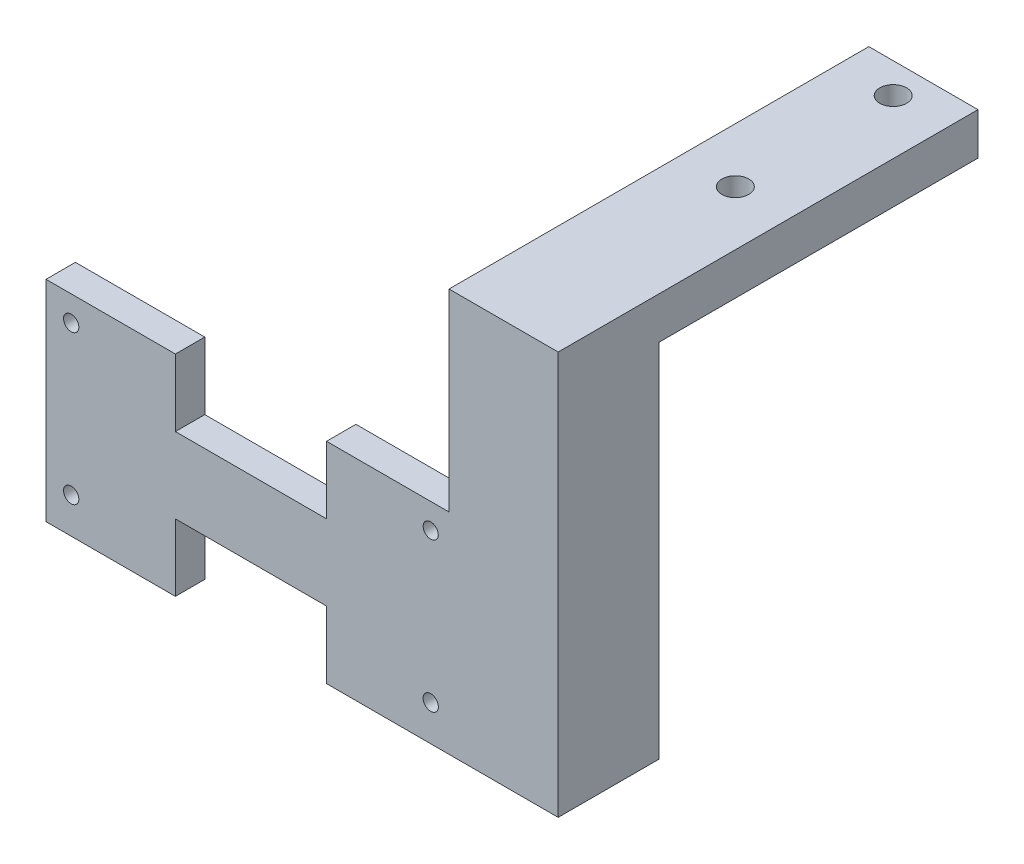
ISO-10303-21;
HEADER;
FILE_DESCRIPTION(('STEP AP214'),'2;1');
FILE_NAME('part.step','',(''),(''),'','','');
FILE_SCHEMA(('AUTOMOTIVE_DESIGN { 1 0 10303 214 1 1 1 1 }'));
ENDSEC;
DATA;
#1=APPLICATION_CONTEXT('core data for automotive mechanical design processes');
#2=APPLICATION_PROTOCOL_DEFINITION('international standard','automotive_design',2000,#1);
#3=PRODUCT_CONTEXT('',#1,'mechanical');
#4=PRODUCT('Part','Part','',(#3));
#5=PRODUCT_RELATED_PRODUCT_CATEGORY('part','',(#4));
#6=PRODUCT_DEFINITION_FORMATION('','',#4);
#7=PRODUCT_DEFINITION_CONTEXT('part definition',#1,'design');
#8=PRODUCT_DEFINITION('design','',#6,#7);
#9=PRODUCT_DEFINITION_SHAPE('','',#8);
#10=(LENGTH_UNIT() NAMED_UNIT(*) SI_UNIT(.MILLI.,.METRE.));
#11=(NAMED_UNIT(*) PLANE_ANGLE_UNIT() SI_UNIT($,.RADIAN.));
#12=(NAMED_UNIT(*) SI_UNIT($,.STERADIAN.) SOLID_ANGLE_UNIT());
#13=UNCERTAINTY_MEASURE_WITH_UNIT(LENGTH_MEASURE(1.E-05),#10,'distance_accuracy_value','');
#14=(GEOMETRIC_REPRESENTATION_CONTEXT(3) GLOBAL_UNCERTAINTY_ASSIGNED_CONTEXT((#13)) GLOBAL_UNIT_ASSIGNED_CONTEXT((#10,
#11,#12)) REPRESENTATION_CONTEXT('',''));
#15=CARTESIAN_POINT('',(0.,0.,0.));
#16=DIRECTION('',(0.,0.,1.));
#17=DIRECTION('',(1.,0.,0.));
#18=AXIS2_PLACEMENT_3D('',#15,#16,#17);
#19=CARTESIAN_POINT('',(0.,-45.5,0.));
#20=DIRECTION('',(0.,-1.,0.));
#21=DIRECTION('',(0.,0.,-1.));
#22=AXIS2_PLACEMENT_3D('',#19,#20,#21);
#23=PLANE('',#22);
#24=DIRECTION('',(0.,0.,1.));
#25=VECTOR('',#24,1.);
#26=CARTESIAN_POINT('',(-39.09,-45.5,21.));
#27=LINE('',#26,#25);
#28=CARTESIAN_POINT('',(-39.09,-45.5,33.5));
#29=VERTEX_POINT('',#28);
#30=CARTESIAN_POINT('',(-39.09,-45.5,37.));
#31=VERTEX_POINT('',#30);
#32=EDGE_CURVE('E339',#29,#31,#27,.T.);
#33=ORIENTED_EDGE('',*,*,#32,.T.);
#34=DIRECTION('',(-1.,0.,0.));
#35=VECTOR('',#34,1.);
#36=CARTESIAN_POINT('',(-6.5,-45.5,37.));
#37=LINE('',#36,#35);
#38=CARTESIAN_POINT('',(-54.5,-45.5,37.));
#39=VERTEX_POINT('',#38);
#40=EDGE_CURVE('E217',#31,#39,#37,.T.);
#41=ORIENTED_EDGE('',*,*,#40,.T.);
#42=DIRECTION('',(0.,0.,1.));
#43=VECTOR('',#42,1.);
#44=CARTESIAN_POINT('',(-54.5,-45.5,37.));
#45=LINE('',#44,#43);
#46=CARTESIAN_POINT('',(-54.5,-45.5,33.5));
#47=VERTEX_POINT('',#46);
#48=EDGE_CURVE('E381',#47,#39,#45,.T.);
#49=ORIENTED_EDGE('',*,*,#48,.F.);
#50=DIRECTION('',(1.,0.,0.));
#51=VECTOR('',#50,1.);
#52=CARTESIAN_POINT('',(-54.5,-45.5,33.5));
#53=LINE('',#52,#51);
#54=EDGE_CURVE('E390',#47,#29,#53,.T.);
#55=ORIENTED_EDGE('',*,*,#54,.T.);
#56=EDGE_LOOP('',(#33,#41,#49,#55));
#57=FACE_BOUND('',#56,.T.);
#58=ADVANCED_FACE('F45',(#57),#23,.T.);
#59=CARTESIAN_POINT('',(-54.5,-20.5,37.));
#60=DIRECTION('',(0.,-1.,0.));
#61=DIRECTION('',(0.,0.,-1.));
#62=AXIS2_PLACEMENT_3D('',#59,#60,#61);
#63=PLANE('',#62);
#64=DIRECTION('',(1.,0.,0.));
#65=VECTOR('',#64,1.);
#66=CARTESIAN_POINT('',(-54.5,-20.5,33.5));
#67=LINE('',#66,#65);
#68=CARTESIAN_POINT('',(-21.09,-20.5,33.5));
#69=VERTEX_POINT('',#68);
#70=CARTESIAN_POINT('',(-6.49999999999999,-20.5,33.5));
#71=VERTEX_POINT('',#70);
#72=EDGE_CURVE('E184',#69,#71,#67,.T.);
#73=ORIENTED_EDGE('',*,*,#72,.F.);
#74=DIRECTION('',(0.,0.,1.));
#75=VECTOR('',#74,1.);
#76=CARTESIAN_POINT('',(-21.09,-20.5,21.));
#77=LINE('',#76,#75);
#78=CARTESIAN_POINT('',(-21.09,-20.5,37.));
#79=VERTEX_POINT('',#78);
#80=EDGE_CURVE('E167',#69,#79,#77,.T.);
#81=ORIENTED_EDGE('',*,*,#80,.T.);
#82=DIRECTION('',(1.,0.,0.));
#83=VECTOR('',#82,1.);
#84=CARTESIAN_POINT('',(-54.5,-20.5,37.));
#85=LINE('',#84,#83);
#86=CARTESIAN_POINT('',(-6.5,-20.5,37.));
#87=VERTEX_POINT('',#86);
#88=EDGE_CURVE('E182',#79,#87,#85,.T.);
#89=ORIENTED_EDGE('',*,*,#88,.T.);
#90=DIRECTION('',(0.,0.,-1.));
#91=VECTOR('',#90,1.);
#92=CARTESIAN_POINT('',(-6.49999999999999,-20.5,37.));
#93=LINE('',#92,#91);
#94=EDGE_CURVE('E304',#87,#71,#93,.T.);
#95=ORIENTED_EDGE('',*,*,#94,.T.);
#96=EDGE_LOOP('',(#73,#81,#89,#95));
#97=FACE_BOUND('',#96,.T.);
#98=ADVANCED_FACE('F180',(#97),#63,.F.);
#99=CARTESIAN_POINT('',(-6.5,2.5,-13.));
#100=DIRECTION('',(1.,0.,0.));
#101=DIRECTION('',(0.,0.,-1.));
#102=AXIS2_PLACEMENT_3D('',#99,#100,#101);
#103=PLANE('',#102);
#104=DIRECTION('',(0.,-1.,0.));
#105=VECTOR('',#104,1.);
#106=CARTESIAN_POINT('',(-6.49999999999999,-45.5,33.5));
#107=LINE('',#106,#105);
#108=CARTESIAN_POINT('',(-6.5,-45.5,33.5));
#109=VERTEX_POINT('',#108);
#110=EDGE_CURVE('E375',#71,#109,#107,.T.);
#111=ORIENTED_EDGE('',*,*,#110,.F.);
#112=ORIENTED_EDGE('',*,*,#94,.F.);
#113=DIRECTION('',(0.,-1.,0.));
#114=VECTOR('',#113,1.);
#115=CARTESIAN_POINT('',(-6.5,2.5,37.));
#116=LINE('',#115,#114);
#117=CARTESIAN_POINT('',(-6.5,2.5,37.));
#118=VERTEX_POINT('',#117);
#119=EDGE_CURVE('E194',#118,#87,#116,.T.);
#120=ORIENTED_EDGE('',*,*,#119,.F.);
#121=DIRECTION('',(0.,0.,1.));
#122=VECTOR('',#121,1.);
#123=CARTESIAN_POINT('',(-6.5,2.5,-13.));
#124=LINE('',#123,#122);
#125=CARTESIAN_POINT('',(-6.5,2.5,-13.));
#126=VERTEX_POINT('',#125);
#127=EDGE_CURVE('E259',#126,#118,#124,.T.);
#128=ORIENTED_EDGE('',*,*,#127,.F.);
#129=DIRECTION('',(0.,-1.,0.));
#130=VECTOR('',#129,1.);
#131=CARTESIAN_POINT('',(-6.5,2.5,-13.));
#132=LINE('',#131,#130);
#133=CARTESIAN_POINT('',(-6.5,-2.5,-13.));
#134=VERTEX_POINT('',#133);
#135=EDGE_CURVE('E262',#126,#134,#132,.T.);
#136=ORIENTED_EDGE('',*,*,#135,.T.);
#137=DIRECTION('',(0.,0.,1.));
#138=VECTOR('',#137,1.);
#139=CARTESIAN_POINT('',(-6.5,-2.5,-13.));
#140=LINE('',#139,#138);
#141=CARTESIAN_POINT('',(-6.5,-2.5,25.));
#142=VERTEX_POINT('',#141);
#143=EDGE_CURVE('E256',#134,#142,#140,.T.);
#144=ORIENTED_EDGE('',*,*,#143,.T.);
#145=DIRECTION('',(0.,1.,0.));
#146=VECTOR('',#145,1.);
#147=CARTESIAN_POINT('',(-6.49999999999999,-45.5,25.));
#148=LINE('',#147,#146);
#149=CARTESIAN_POINT('',(-6.49999999999999,-45.5,25.));
#150=VERTEX_POINT('',#149);
#151=EDGE_CURVE('E229',#150,#142,#148,.T.);
#152=ORIENTED_EDGE('',*,*,#151,.F.);
#153=DIRECTION('',(0.,0.,-1.));
#154=VECTOR('',#153,1.);
#155=CARTESIAN_POINT('',(-6.5,-45.5,37.));
#156=LINE('',#155,#154);
#157=EDGE_CURVE('E207',#109,#150,#156,.T.);
#158=ORIENTED_EDGE('',*,*,#157,.F.);
#159=EDGE_LOOP('',(#111,#112,#120,#128,#136,#144,#152,#158));
#160=FACE_BOUND('',#159,.T.);
#161=ADVANCED_FACE('F407',(#160),#103,.F.);
#162=CARTESIAN_POINT('',(0.,-2.5,0.));
#163=DIRECTION('',(0.,1.,0.));
#164=DIRECTION('',(0.,0.,1.));
#165=AXIS2_PLACEMENT_3D('',#162,#163,#164);
#166=PLANE('',#165);
#167=CARTESIAN_POINT('',(0.,-2.5,9.4));
#168=DIRECTION('',(0.,1.,0.));
#169=DIRECTION('',(0.,0.,1.));
#170=AXIS2_PLACEMENT_3D('',#167,#168,#169);
#171=CIRCLE('',#170,1.6);
#172=CARTESIAN_POINT('',(0.,-2.5,11.));
#173=VERTEX_POINT('',#172);
#174=EDGE_CURVE('E247',#173,#173,#171,.T.);
#175=ORIENTED_EDGE('',*,*,#174,.T.);
#176=EDGE_LOOP('',(#175));
#177=FACE_BOUND('',#176,.T.);
#178=CARTESIAN_POINT('',(0.,-2.5,-9.4));
#179=DIRECTION('',(0.,1.,0.));
#180=DIRECTION('',(0.,0.,1.));
#181=AXIS2_PLACEMENT_3D('',#178,#179,#180);
#182=CIRCLE('',#181,1.6);
#183=CARTESIAN_POINT('',(0.,-2.5,-7.8));
#184=VERTEX_POINT('',#183);
#185=EDGE_CURVE('E267',#184,#184,#182,.T.);
#186=ORIENTED_EDGE('',*,*,#185,.T.);
#187=EDGE_LOOP('',(#186));
#188=FACE_BOUND('',#187,.T.);
#189=DIRECTION('',(1.,0.,0.));
#190=VECTOR('',#189,1.);
#191=CARTESIAN_POINT('',(-6.49999999999999,-2.5,25.));
#192=LINE('',#191,#190);
#193=CARTESIAN_POINT('',(6.5,-2.5,25.));
#194=VERTEX_POINT('',#193);
#195=EDGE_CURVE('E202',#142,#194,#192,.T.);
#196=ORIENTED_EDGE('',*,*,#195,.F.);
#197=ORIENTED_EDGE('',*,*,#143,.F.);
#198=DIRECTION('',(-1.,0.,0.));
#199=VECTOR('',#198,1.);
#200=CARTESIAN_POINT('',(-6.5,-2.5,-13.));
#201=LINE('',#200,#199);
#202=CARTESIAN_POINT('',(6.5,-2.5,-13.));
#203=VERTEX_POINT('',#202);
#204=EDGE_CURVE('E266',#203,#134,#201,.T.);
#205=ORIENTED_EDGE('',*,*,#204,.F.);
#206=DIRECTION('',(0.,0.,-1.));
#207=VECTOR('',#206,1.);
#208=CARTESIAN_POINT('',(6.5,-2.5,-13.));
#209=LINE('',#208,#207);
#210=EDGE_CURVE('E263',#194,#203,#209,.T.);
#211=ORIENTED_EDGE('',*,*,#210,.F.);
#212=EDGE_LOOP('',(#196,#197,#205,#211));
#213=FACE_BOUND('',#212,.T.);
#214=ADVANCED_FACE('F480',(#177,#188,#213),#166,.F.);
#215=CARTESIAN_POINT('',(6.5,2.5,-13.));
#216=DIRECTION('',(-1.,0.,0.));
#217=DIRECTION('',(0.,0.,1.));
#218=AXIS2_PLACEMENT_3D('',#215,#216,#217);
#219=PLANE('',#218);
#220=DIRECTION('',(0.,1.,0.));
#221=VECTOR('',#220,1.);
#222=CARTESIAN_POINT('',(6.5,2.5,37.));
#223=LINE('',#222,#221);
#224=CARTESIAN_POINT('',(6.5,-45.5,37.));
#225=VERTEX_POINT('',#224);
#226=CARTESIAN_POINT('',(6.5,2.5,37.));
#227=VERTEX_POINT('',#226);
#228=EDGE_CURVE('E235',#225,#227,#223,.T.);
#229=ORIENTED_EDGE('',*,*,#228,.F.);
#230=DIRECTION('',(0.,0.,1.));
#231=VECTOR('',#230,1.);
#232=CARTESIAN_POINT('',(6.5,-45.5,37.));
#233=LINE('',#232,#231);
#234=CARTESIAN_POINT('',(6.5,-45.5,25.));
#235=VERTEX_POINT('',#234);
#236=EDGE_CURVE('E213',#235,#225,#233,.T.);
#237=ORIENTED_EDGE('',*,*,#236,.F.);
#238=DIRECTION('',(0.,1.,0.));
#239=VECTOR('',#238,1.);
#240=CARTESIAN_POINT('',(6.5,-45.5,25.));
#241=LINE('',#240,#239);
#242=EDGE_CURVE('E222',#235,#194,#241,.T.);
#243=ORIENTED_EDGE('',*,*,#242,.T.);
#244=ORIENTED_EDGE('',*,*,#210,.T.);
#245=DIRECTION('',(0.,-1.,0.));
#246=VECTOR('',#245,1.);
#247=CARTESIAN_POINT('',(6.5,2.5,-13.));
#248=LINE('',#247,#246);
#249=CARTESIAN_POINT('',(6.5,2.5,-13.));
#250=VERTEX_POINT('',#249);
#251=EDGE_CURVE('E276',#250,#203,#248,.T.);
#252=ORIENTED_EDGE('',*,*,#251,.F.);
#253=DIRECTION('',(0.,0.,-1.));
#254=VECTOR('',#253,1.);
#255=CARTESIAN_POINT('',(6.5,2.5,-13.));
#256=LINE('',#255,#254);
#257=EDGE_CURVE('E251',#227,#250,#256,.T.);
#258=ORIENTED_EDGE('',*,*,#257,.F.);
#259=EDGE_LOOP('',(#229,#237,#243,#244,#252,#258));
#260=FACE_BOUND('',#259,.T.);
#261=ADVANCED_FACE('F47',(#260),#219,.F.);
#262=CARTESIAN_POINT('',(-6.5,2.5,-13.));
#263=DIRECTION('',(0.,0.,1.));
#264=DIRECTION('',(1.,0.,0.));
#265=AXIS2_PLACEMENT_3D('',#262,#263,#264);
#266=PLANE('',#265);
#267=ORIENTED_EDGE('',*,*,#204,.T.);
#268=ORIENTED_EDGE('',*,*,#135,.F.);
#269=DIRECTION('',(-1.,0.,0.));
#270=VECTOR('',#269,1.);
#271=CARTESIAN_POINT('',(-6.5,2.5,-13.));
#272=LINE('',#271,#270);
#273=EDGE_CURVE('E255',#250,#126,#272,.T.);
#274=ORIENTED_EDGE('',*,*,#273,.F.);
#275=ORIENTED_EDGE('',*,*,#251,.T.);
#276=EDGE_LOOP('',(#267,#268,#274,#275));
#277=FACE_BOUND('',#276,.T.);
#278=ADVANCED_FACE('F478',(#277),#266,.F.);
#279=CARTESIAN_POINT('',(0.,2.5,0.));
#280=DIRECTION('',(0.,1.,0.));
#281=DIRECTION('',(0.,0.,1.));
#282=AXIS2_PLACEMENT_3D('',#279,#280,#281);
#283=PLANE('',#282);
#284=CARTESIAN_POINT('',(0.,2.5,-9.4));
#285=DIRECTION('',(0.,1.,0.));
#286=DIRECTION('',(0.,0.,1.));
#287=AXIS2_PLACEMENT_3D('',#284,#285,#286);
#288=CIRCLE('',#287,1.6);
#289=CARTESIAN_POINT('',(0.,2.5,-7.8));
#290=VERTEX_POINT('',#289);
#291=EDGE_CURVE('E243',#290,#290,#288,.T.);
#292=ORIENTED_EDGE('',*,*,#291,.F.);
#293=EDGE_LOOP('',(#292));
#294=FACE_BOUND('',#293,.T.);
#295=CARTESIAN_POINT('',(0.,2.5,9.4));
#296=DIRECTION('',(0.,1.,0.));
#297=DIRECTION('',(0.,0.,-1.));
#298=AXIS2_PLACEMENT_3D('',#295,#296,#297);
#299=CIRCLE('',#298,1.6);
#300=CARTESIAN_POINT('',(0.,2.5,7.8));
#301=VERTEX_POINT('',#300);
#302=EDGE_CURVE('E242',#301,#301,#299,.T.);
#303=ORIENTED_EDGE('',*,*,#302,.F.);
#304=EDGE_LOOP('',(#303));
#305=FACE_BOUND('',#304,.T.);
#306=ORIENTED_EDGE('',*,*,#257,.T.);
#307=ORIENTED_EDGE('',*,*,#273,.T.);
#308=ORIENTED_EDGE('',*,*,#127,.T.);
#309=DIRECTION('',(-1.,0.,0.));
#310=VECTOR('',#309,1.);
#311=CARTESIAN_POINT('',(-6.5,2.5,37.));
#312=LINE('',#311,#310);
#313=EDGE_CURVE('E239',#227,#118,#312,.T.);
#314=ORIENTED_EDGE('',*,*,#313,.F.);
#315=EDGE_LOOP('',(#306,#307,#308,#314));
#316=FACE_BOUND('',#315,.T.);
#317=ADVANCED_FACE('F474',(#294,#305,#316),#283,.T.);
#318=CARTESIAN_POINT('',(0.,-10.5,9.4));
#319=DIRECTION('',(0.,1.,0.));
#320=DIRECTION('',(0.,0.,1.));
#321=AXIS2_PLACEMENT_3D('',#318,#319,#320);
#322=CYLINDRICAL_SURFACE('',#321,1.6);
#323=ORIENTED_EDGE('',*,*,#302,.T.);
#324=EDGE_LOOP('',(#323));
#325=FACE_BOUND('',#324,.T.);
#326=ORIENTED_EDGE('',*,*,#174,.F.);
#327=EDGE_LOOP('',(#326));
#328=FACE_BOUND('',#327,.T.);
#329=ADVANCED_FACE('F470',(#325,#328),#322,.F.);
#330=CARTESIAN_POINT('',(0.,-10.5,-9.4));
#331=DIRECTION('',(0.,1.,0.));
#332=DIRECTION('',(0.,0.,1.));
#333=AXIS2_PLACEMENT_3D('',#330,#331,#332);
#334=CYLINDRICAL_SURFACE('',#333,1.6);
#335=ORIENTED_EDGE('',*,*,#291,.T.);
#336=EDGE_LOOP('',(#335));
#337=FACE_BOUND('',#336,.T.);
#338=ORIENTED_EDGE('',*,*,#185,.F.);
#339=EDGE_LOOP('',(#338));
#340=FACE_BOUND('',#339,.T.);
#341=ADVANCED_FACE('F465',(#337,#340),#334,.F.);
#342=CARTESIAN_POINT('',(0.,0.,37.));
#343=DIRECTION('',(0.,0.,1.));
#344=DIRECTION('',(1.,0.,0.));
#345=AXIS2_PLACEMENT_3D('',#342,#343,#344);
#346=PLANE('',#345);
#347=DIRECTION('',(0.,1.,0.));
#348=VECTOR('',#347,1.);
#349=CARTESIAN_POINT('',(-21.09,-28.5,37.));
#350=LINE('',#349,#348);
#351=CARTESIAN_POINT('',(-21.09,-28.5,37.));
#352=VERTEX_POINT('',#351);
#353=EDGE_CURVE('E164',#352,#79,#350,.T.);
#354=ORIENTED_EDGE('',*,*,#353,.F.);
#355=DIRECTION('',(1.,0.,0.));
#356=VECTOR('',#355,1.);
#357=CARTESIAN_POINT('',(-39.09,-28.5,37.));
#358=LINE('',#357,#356);
#359=CARTESIAN_POINT('',(-39.09,-28.5,37.));
#360=VERTEX_POINT('',#359);
#361=EDGE_CURVE('E187',#360,#352,#358,.T.);
#362=ORIENTED_EDGE('',*,*,#361,.F.);
#363=DIRECTION('',(0.,-1.,0.));
#364=VECTOR('',#363,1.);
#365=CARTESIAN_POINT('',(-39.09,-28.5,37.));
#366=LINE('',#365,#364);
#367=CARTESIAN_POINT('',(-39.09,-20.5,37.));
#368=VERTEX_POINT('',#367);
#369=EDGE_CURVE('E175',#368,#360,#366,.T.);
#370=ORIENTED_EDGE('',*,*,#369,.F.);
#371=CARTESIAN_POINT('',(-54.5,-20.5,37.));
#372=VERTEX_POINT('',#371);
#373=EDGE_CURVE('E196',#372,#368,#85,.T.);
#374=ORIENTED_EDGE('',*,*,#373,.F.);
#375=DIRECTION('',(0.,1.,0.));
#376=VECTOR('',#375,1.);
#377=CARTESIAN_POINT('',(-54.5,-45.5,37.));
#378=LINE('',#377,#376);
#379=EDGE_CURVE('E370',#39,#372,#378,.T.);
#380=ORIENTED_EDGE('',*,*,#379,.F.);
#381=ORIENTED_EDGE('',*,*,#40,.F.);
#382=DIRECTION('',(0.,-1.,0.));
#383=VECTOR('',#382,1.);
#384=CARTESIAN_POINT('',(-39.09,-37.5,37.));
#385=LINE('',#384,#383);
#386=CARTESIAN_POINT('',(-39.09,-37.5,37.));
#387=VERTEX_POINT('',#386);
#388=EDGE_CURVE('E176',#387,#31,#385,.T.);
#389=ORIENTED_EDGE('',*,*,#388,.F.);
#390=DIRECTION('',(-1.,0.,0.));
#391=VECTOR('',#390,1.);
#392=CARTESIAN_POINT('',(-39.09,-37.5,37.));
#393=LINE('',#392,#391);
#394=CARTESIAN_POINT('',(-21.09,-37.5,37.));
#395=VERTEX_POINT('',#394);
#396=EDGE_CURVE('E343',#395,#387,#393,.T.);
#397=ORIENTED_EDGE('',*,*,#396,.F.);
#398=DIRECTION('',(0.,1.,0.));
#399=VECTOR('',#398,1.);
#400=CARTESIAN_POINT('',(-21.09,-37.5,37.));
#401=LINE('',#400,#399);
#402=CARTESIAN_POINT('',(-21.09,-45.5,37.));
#403=VERTEX_POINT('',#402);
#404=EDGE_CURVE('E355',#403,#395,#401,.T.);
#405=ORIENTED_EDGE('',*,*,#404,.F.);
#406=EDGE_CURVE('E218',#225,#403,#37,.T.);
#407=ORIENTED_EDGE('',*,*,#406,.F.);
#408=ORIENTED_EDGE('',*,*,#228,.T.);
#409=ORIENTED_EDGE('',*,*,#313,.T.);
#410=ORIENTED_EDGE('',*,*,#119,.T.);
#411=ORIENTED_EDGE('',*,*,#88,.F.);
#412=EDGE_LOOP('',(#354,#362,#370,#374,#380,#381,#389,#397,#405,#407,#408,#409,#410,#411));
#413=FACE_BOUND('',#412,.T.);
#414=CARTESIAN_POINT('',(-8.68,-23.5,37.));
#415=DIRECTION('',(0.,0.,1.));
#416=DIRECTION('',(1.,0.,0.));
#417=AXIS2_PLACEMENT_3D('',#414,#415,#416);
#418=CIRCLE('',#417,0.900000000000001);
#419=CARTESIAN_POINT('',(-7.78,-23.5,37.));
#420=VERTEX_POINT('',#419);
#421=EDGE_CURVE('E360',#420,#420,#418,.T.);
#422=ORIENTED_EDGE('',*,*,#421,.F.);
#423=EDGE_LOOP('',(#422));
#424=FACE_BOUND('',#423,.T.);
#425=CARTESIAN_POINT('',(-51.5,-41.24,37.));
#426=DIRECTION('',(0.,0.,1.));
#427=DIRECTION('',(1.,0.,0.));
#428=AXIS2_PLACEMENT_3D('',#425,#426,#427);
#429=CIRCLE('',#428,0.91);
#430=CARTESIAN_POINT('',(-50.59,-41.24,37.));
#431=VERTEX_POINT('',#430);
#432=EDGE_CURVE('E331',#431,#431,#429,.T.);
#433=ORIENTED_EDGE('',*,*,#432,.F.);
#434=EDGE_LOOP('',(#433));
#435=FACE_BOUND('',#434,.T.);
#436=CARTESIAN_POINT('',(-8.68,-41.24,37.));
#437=DIRECTION('',(0.,0.,1.));
#438=DIRECTION('',(1.,0.,0.));
#439=AXIS2_PLACEMENT_3D('',#436,#437,#438);
#440=CIRCLE('',#439,0.91);
#441=CARTESIAN_POINT('',(-7.77,-41.24,37.));
#442=VERTEX_POINT('',#441);
#443=EDGE_CURVE('E326',#442,#442,#440,.T.);
#444=ORIENTED_EDGE('',*,*,#443,.F.);
#445=EDGE_LOOP('',(#444));
#446=FACE_BOUND('',#445,.T.);
#447=CARTESIAN_POINT('',(-51.5,-23.5,37.));
#448=DIRECTION('',(0.,0.,1.));
#449=DIRECTION('',(1.,0.,0.));
#450=AXIS2_PLACEMENT_3D('',#447,#448,#449);
#451=CIRCLE('',#450,0.91);
#452=CARTESIAN_POINT('',(-50.59,-23.5,37.));
#453=VERTEX_POINT('',#452);
#454=EDGE_CURVE('E292',#453,#453,#451,.T.);
#455=ORIENTED_EDGE('',*,*,#454,.F.);
#456=EDGE_LOOP('',(#455));
#457=FACE_BOUND('',#456,.T.);
#458=ADVANCED_FACE('F190',(#413,#424,#435,#446,#457),#346,.T.);
#459=CARTESIAN_POINT('',(-6.49999999999999,-45.5,25.));
#460=DIRECTION('',(0.,0.,1.));
#461=DIRECTION('',(1.,0.,0.));
#462=AXIS2_PLACEMENT_3D('',#459,#460,#461);
#463=PLANE('',#462);
#464=ORIENTED_EDGE('',*,*,#195,.T.);
#465=ORIENTED_EDGE('',*,*,#242,.F.);
#466=DIRECTION('',(1.,0.,0.));
#467=VECTOR('',#466,1.);
#468=CARTESIAN_POINT('',(-6.49999999999999,-45.5,25.));
#469=LINE('',#468,#467);
#470=EDGE_CURVE('E210',#150,#235,#469,.T.);
#471=ORIENTED_EDGE('',*,*,#470,.F.);
#472=ORIENTED_EDGE('',*,*,#151,.T.);
#473=EDGE_LOOP('',(#464,#465,#471,#472));
#474=FACE_BOUND('',#473,.T.);
#475=ADVANCED_FACE('F410',(#474),#463,.F.);
#476=DIRECTION('',(0.,0.,1.));
#477=VECTOR('',#476,1.);
#478=CARTESIAN_POINT('',(-21.09,-45.5,21.));
#479=LINE('',#478,#477);
#480=CARTESIAN_POINT('',(-21.09,-45.5,33.5));
#481=VERTEX_POINT('',#480);
#482=EDGE_CURVE('E344',#481,#403,#479,.T.);
#483=ORIENTED_EDGE('',*,*,#482,.F.);
#484=EDGE_CURVE('E385',#481,#109,#53,.T.);
#485=ORIENTED_EDGE('',*,*,#484,.T.);
#486=ORIENTED_EDGE('',*,*,#157,.T.);
#487=ORIENTED_EDGE('',*,*,#470,.T.);
#488=ORIENTED_EDGE('',*,*,#236,.T.);
#489=ORIENTED_EDGE('',*,*,#406,.T.);
#490=EDGE_LOOP('',(#483,#485,#486,#487,#488,#489));
#491=FACE_BOUND('',#490,.T.);
#492=ADVANCED_FACE('F402',(#491),#23,.T.);
#493=ORIENTED_EDGE('',*,*,#373,.T.);
#494=DIRECTION('',(0.,0.,1.));
#495=VECTOR('',#494,1.);
#496=CARTESIAN_POINT('',(-39.09,-20.5,21.));
#497=LINE('',#496,#495);
#498=CARTESIAN_POINT('',(-39.09,-20.5,33.5));
#499=VERTEX_POINT('',#498);
#500=EDGE_CURVE('E186',#499,#368,#497,.T.);
#501=ORIENTED_EDGE('',*,*,#500,.F.);
#502=CARTESIAN_POINT('',(-54.5,-20.5,33.5));
#503=VERTEX_POINT('',#502);
#504=EDGE_CURVE('E197',#503,#499,#67,.T.);
#505=ORIENTED_EDGE('',*,*,#504,.F.);
#506=DIRECTION('',(0.,0.,-1.));
#507=VECTOR('',#506,1.);
#508=CARTESIAN_POINT('',(-54.5,-20.5,37.));
#509=LINE('',#508,#507);
#510=EDGE_CURVE('E374',#372,#503,#509,.T.);
#511=ORIENTED_EDGE('',*,*,#510,.F.);
#512=EDGE_LOOP('',(#493,#501,#505,#511));
#513=FACE_BOUND('',#512,.T.);
#514=ADVANCED_FACE('F436',(#513),#63,.F.);
#515=CARTESIAN_POINT('',(-54.5,-45.5,33.5));
#516=DIRECTION('',(0.,0.,1.));
#517=DIRECTION('',(1.,0.,0.));
#518=AXIS2_PLACEMENT_3D('',#515,#516,#517);
#519=PLANE('',#518);
#520=CARTESIAN_POINT('',(-8.68,-23.5,33.5));
#521=DIRECTION('',(0.,0.,1.));
#522=DIRECTION('',(1.,0.,0.));
#523=AXIS2_PLACEMENT_3D('',#520,#521,#522);
#524=CIRCLE('',#523,0.900000000000001);
#525=CARTESIAN_POINT('',(-7.78,-23.5,33.5));
#526=VERTEX_POINT('',#525);
#527=EDGE_CURVE('E300',#526,#526,#524,.T.);
#528=ORIENTED_EDGE('',*,*,#527,.T.);
#529=EDGE_LOOP('',(#528));
#530=FACE_BOUND('',#529,.T.);
#531=CARTESIAN_POINT('',(-51.5,-41.24,33.5));
#532=DIRECTION('',(0.,0.,1.));
#533=DIRECTION('',(1.,0.,0.));
#534=AXIS2_PLACEMENT_3D('',#531,#532,#533);
#535=CIRCLE('',#534,0.91);
#536=CARTESIAN_POINT('',(-50.59,-41.24,33.5));
#537=VERTEX_POINT('',#536);
#538=EDGE_CURVE('E296',#537,#537,#535,.T.);
#539=ORIENTED_EDGE('',*,*,#538,.T.);
#540=EDGE_LOOP('',(#539));
#541=FACE_BOUND('',#540,.T.);
#542=CARTESIAN_POINT('',(-8.68,-41.24,33.5));
#543=DIRECTION('',(0.,0.,1.));
#544=DIRECTION('',(1.,0.,0.));
#545=AXIS2_PLACEMENT_3D('',#542,#543,#544);
#546=CIRCLE('',#545,0.91);
#547=CARTESIAN_POINT('',(-7.77,-41.24,33.5));
#548=VERTEX_POINT('',#547);
#549=EDGE_CURVE('E291',#548,#548,#546,.T.);
#550=ORIENTED_EDGE('',*,*,#549,.T.);
#551=EDGE_LOOP('',(#550));
#552=FACE_BOUND('',#551,.T.);
#553=CARTESIAN_POINT('',(-51.5,-23.5,33.5));
#554=DIRECTION('',(0.,0.,1.));
#555=DIRECTION('',(1.,0.,0.));
#556=AXIS2_PLACEMENT_3D('',#553,#554,#555);
#557=CIRCLE('',#556,0.91);
#558=CARTESIAN_POINT('',(-50.59,-23.5,33.5));
#559=VERTEX_POINT('',#558);
#560=EDGE_CURVE('E287',#559,#559,#557,.T.);
#561=ORIENTED_EDGE('',*,*,#560,.T.);
#562=EDGE_LOOP('',(#561));
#563=FACE_BOUND('',#562,.T.);
#564=DIRECTION('',(1.,0.,0.));
#565=VECTOR('',#564,1.);
#566=CARTESIAN_POINT('',(-54.5,-28.5,33.5));
#567=LINE('',#566,#565);
#568=CARTESIAN_POINT('',(-39.09,-28.5,33.5));
#569=VERTEX_POINT('',#568);
#570=CARTESIAN_POINT('',(-21.09,-28.5,33.5));
#571=VERTEX_POINT('',#570);
#572=EDGE_CURVE('E54',#569,#571,#567,.T.);
#573=ORIENTED_EDGE('',*,*,#572,.T.);
#574=DIRECTION('',(0.,1.,0.));
#575=VECTOR('',#574,1.);
#576=CARTESIAN_POINT('',(-21.09,-45.5,33.5));
#577=LINE('',#576,#575);
#578=EDGE_CURVE('E11',#571,#69,#577,.T.);
#579=ORIENTED_EDGE('',*,*,#578,.T.);
#580=ORIENTED_EDGE('',*,*,#72,.T.);
#581=ORIENTED_EDGE('',*,*,#110,.T.);
#582=ORIENTED_EDGE('',*,*,#484,.F.);
#583=DIRECTION('',(0.,1.,0.));
#584=VECTOR('',#583,1.);
#585=CARTESIAN_POINT('',(-21.09,-45.5,33.5));
#586=LINE('',#585,#584);
#587=CARTESIAN_POINT('',(-21.09,-37.5,33.5));
#588=VERTEX_POINT('',#587);
#589=EDGE_CURVE('E280',#481,#588,#586,.T.);
#590=ORIENTED_EDGE('',*,*,#589,.T.);
#591=DIRECTION('',(-1.,0.,0.));
#592=VECTOR('',#591,1.);
#593=CARTESIAN_POINT('',(-54.5,-37.5,33.5));
#594=LINE('',#593,#592);
#595=CARTESIAN_POINT('',(-39.09,-37.5,33.5));
#596=VERTEX_POINT('',#595);
#597=EDGE_CURVE('E308',#588,#596,#594,.T.);
#598=ORIENTED_EDGE('',*,*,#597,.T.);
#599=DIRECTION('',(0.,-1.,0.));
#600=VECTOR('',#599,1.);
#601=CARTESIAN_POINT('',(-39.09,-45.5,33.5));
#602=LINE('',#601,#600);
#603=EDGE_CURVE('E312',#596,#29,#602,.T.);
#604=ORIENTED_EDGE('',*,*,#603,.T.);
#605=ORIENTED_EDGE('',*,*,#54,.F.);
#606=DIRECTION('',(0.,-1.,0.));
#607=VECTOR('',#606,1.);
#608=CARTESIAN_POINT('',(-54.5,-45.5,33.5));
#609=LINE('',#608,#607);
#610=EDGE_CURVE('E378',#503,#47,#609,.T.);
#611=ORIENTED_EDGE('',*,*,#610,.F.);
#612=ORIENTED_EDGE('',*,*,#504,.T.);
#613=DIRECTION('',(0.,-1.,0.));
#614=VECTOR('',#613,1.);
#615=CARTESIAN_POINT('',(-39.09,-45.5,33.5));
#616=LINE('',#615,#614);
#617=EDGE_CURVE('E316',#499,#569,#616,.T.);
#618=ORIENTED_EDGE('',*,*,#617,.T.);
#619=EDGE_LOOP('',(#573,#579,#580,#581,#582,#590,#598,#604,#605,#611,#612,#618));
#620=FACE_BOUND('',#619,.T.);
#621=ADVANCED_FACE('F322',(#530,#541,#552,#563,#620),#519,.F.);
#622=CARTESIAN_POINT('',(-54.5,0.,0.));
#623=DIRECTION('',(-1.,0.,0.));
#624=DIRECTION('',(0.,0.,1.));
#625=AXIS2_PLACEMENT_3D('',#622,#623,#624);
#626=PLANE('',#625);
#627=ORIENTED_EDGE('',*,*,#379,.T.);
#628=ORIENTED_EDGE('',*,*,#510,.T.);
#629=ORIENTED_EDGE('',*,*,#610,.T.);
#630=ORIENTED_EDGE('',*,*,#48,.T.);
#631=EDGE_LOOP('',(#627,#628,#629,#630));
#632=FACE_BOUND('',#631,.T.);
#633=ADVANCED_FACE('F431',(#632),#626,.T.);
#634=CARTESIAN_POINT('',(-51.5,-23.5,21.));
#635=DIRECTION('',(0.,0.,1.));
#636=DIRECTION('',(1.,0.,0.));
#637=AXIS2_PLACEMENT_3D('',#634,#635,#636);
#638=CYLINDRICAL_SURFACE('',#637,0.91);
#639=ORIENTED_EDGE('',*,*,#454,.T.);
#640=EDGE_LOOP('',(#639));
#641=FACE_BOUND('',#640,.T.);
#642=ORIENTED_EDGE('',*,*,#560,.F.);
#643=EDGE_LOOP('',(#642));
#644=FACE_BOUND('',#643,.T.);
#645=ADVANCED_FACE('F592',(#641,#644),#638,.F.);
#646=CARTESIAN_POINT('',(-8.68,-41.24,21.));
#647=DIRECTION('',(0.,0.,1.));
#648=DIRECTION('',(1.,0.,0.));
#649=AXIS2_PLACEMENT_3D('',#646,#647,#648);
#650=CYLINDRICAL_SURFACE('',#649,0.91);
#651=ORIENTED_EDGE('',*,*,#443,.T.);
#652=EDGE_LOOP('',(#651));
#653=FACE_BOUND('',#652,.T.);
#654=ORIENTED_EDGE('',*,*,#549,.F.);
#655=EDGE_LOOP('',(#654));
#656=FACE_BOUND('',#655,.T.);
#657=ADVANCED_FACE('F600',(#653,#656),#650,.F.);
#658=CARTESIAN_POINT('',(-51.5,-41.24,21.));
#659=DIRECTION('',(0.,0.,1.));
#660=DIRECTION('',(1.,0.,0.));
#661=AXIS2_PLACEMENT_3D('',#658,#659,#660);
#662=CYLINDRICAL_SURFACE('',#661,0.91);
#663=ORIENTED_EDGE('',*,*,#432,.T.);
#664=EDGE_LOOP('',(#663));
#665=FACE_BOUND('',#664,.T.);
#666=ORIENTED_EDGE('',*,*,#538,.F.);
#667=EDGE_LOOP('',(#666));
#668=FACE_BOUND('',#667,.T.);
#669=ADVANCED_FACE('F609',(#665,#668),#662,.F.);
#670=CARTESIAN_POINT('',(-8.68,-23.5,21.));
#671=DIRECTION('',(0.,0.,1.));
#672=DIRECTION('',(1.,0.,0.));
#673=AXIS2_PLACEMENT_3D('',#670,#671,#672);
#674=CYLINDRICAL_SURFACE('',#673,0.900000000000001);
#675=ORIENTED_EDGE('',*,*,#421,.T.);
#676=EDGE_LOOP('',(#675));
#677=FACE_BOUND('',#676,.T.);
#678=ORIENTED_EDGE('',*,*,#527,.F.);
#679=EDGE_LOOP('',(#678));
#680=FACE_BOUND('',#679,.T.);
#681=ADVANCED_FACE('F618',(#677,#680),#674,.F.);
#682=CARTESIAN_POINT('',(-39.09,-37.5,21.));
#683=DIRECTION('',(-1.,0.,0.));
#684=DIRECTION('',(0.,0.,1.));
#685=AXIS2_PLACEMENT_3D('',#682,#683,#684);
#686=PLANE('',#685);
#687=DIRECTION('',(0.,0.,1.));
#688=VECTOR('',#687,1.);
#689=CARTESIAN_POINT('',(-39.09,-37.5,21.));
#690=LINE('',#689,#688);
#691=EDGE_CURVE('E349',#596,#387,#690,.T.);
#692=ORIENTED_EDGE('',*,*,#691,.T.);
#693=ORIENTED_EDGE('',*,*,#388,.T.);
#694=ORIENTED_EDGE('',*,*,#32,.F.);
#695=ORIENTED_EDGE('',*,*,#603,.F.);
#696=EDGE_LOOP('',(#692,#693,#694,#695));
#697=FACE_BOUND('',#696,.T.);
#698=ADVANCED_FACE('F424',(#697),#686,.F.);
#699=CARTESIAN_POINT('',(-39.09,-37.5,21.));
#700=DIRECTION('',(0.,1.,0.));
#701=DIRECTION('',(0.,0.,1.));
#702=AXIS2_PLACEMENT_3D('',#699,#700,#701);
#703=PLANE('',#702);
#704=DIRECTION('',(0.,0.,1.));
#705=VECTOR('',#704,1.);
#706=CARTESIAN_POINT('',(-21.09,-37.5,21.));
#707=LINE('',#706,#705);
#708=EDGE_CURVE('E69',#588,#395,#707,.T.);
#709=ORIENTED_EDGE('',*,*,#708,.T.);
#710=ORIENTED_EDGE('',*,*,#396,.T.);
#711=ORIENTED_EDGE('',*,*,#691,.F.);
#712=ORIENTED_EDGE('',*,*,#597,.F.);
#713=EDGE_LOOP('',(#709,#710,#711,#712));
#714=FACE_BOUND('',#713,.T.);
#715=ADVANCED_FACE('F422',(#714),#703,.F.);
#716=CARTESIAN_POINT('',(-21.09,-37.5,21.));
#717=DIRECTION('',(1.,0.,0.));
#718=DIRECTION('',(0.,0.,-1.));
#719=AXIS2_PLACEMENT_3D('',#716,#717,#718);
#720=PLANE('',#719);
#721=ORIENTED_EDGE('',*,*,#482,.T.);
#722=ORIENTED_EDGE('',*,*,#404,.T.);
#723=ORIENTED_EDGE('',*,*,#708,.F.);
#724=ORIENTED_EDGE('',*,*,#589,.F.);
#725=EDGE_LOOP('',(#721,#722,#723,#724));
#726=FACE_BOUND('',#725,.T.);
#727=ADVANCED_FACE('F419',(#726),#720,.F.);
#728=CARTESIAN_POINT('',(-21.09,-28.5,21.));
#729=DIRECTION('',(1.,0.,0.));
#730=DIRECTION('',(0.,0.,-1.));
#731=AXIS2_PLACEMENT_3D('',#728,#729,#730);
#732=PLANE('',#731);
#733=DIRECTION('',(0.,0.,1.));
#734=VECTOR('',#733,1.);
#735=CARTESIAN_POINT('',(-21.09,-28.5,21.));
#736=LINE('',#735,#734);
#737=EDGE_CURVE('E169',#571,#352,#736,.T.);
#738=ORIENTED_EDGE('',*,*,#737,.T.);
#739=ORIENTED_EDGE('',*,*,#353,.T.);
#740=ORIENTED_EDGE('',*,*,#80,.F.);
#741=ORIENTED_EDGE('',*,*,#578,.F.);
#742=EDGE_LOOP('',(#738,#739,#740,#741));
#743=FACE_BOUND('',#742,.T.);
#744=ADVANCED_FACE('F166',(#743),#732,.F.);
#745=CARTESIAN_POINT('',(-39.09,-28.5,21.));
#746=DIRECTION('',(0.,-1.,0.));
#747=DIRECTION('',(0.,0.,-1.));
#748=AXIS2_PLACEMENT_3D('',#745,#746,#747);
#749=PLANE('',#748);
#750=DIRECTION('',(0.,0.,1.));
#751=VECTOR('',#750,1.);
#752=CARTESIAN_POINT('',(-39.09,-28.5,21.));
#753=LINE('',#752,#751);
#754=EDGE_CURVE('E61',#569,#360,#753,.T.);
#755=ORIENTED_EDGE('',*,*,#754,.T.);
#756=ORIENTED_EDGE('',*,*,#361,.T.);
#757=ORIENTED_EDGE('',*,*,#737,.F.);
#758=ORIENTED_EDGE('',*,*,#572,.F.);
#759=EDGE_LOOP('',(#755,#756,#757,#758));
#760=FACE_BOUND('',#759,.T.);
#761=ADVANCED_FACE('F324',(#760),#749,.F.);
#762=CARTESIAN_POINT('',(-39.09,-28.5,21.));
#763=DIRECTION('',(-1.,0.,0.));
#764=DIRECTION('',(0.,0.,1.));
#765=AXIS2_PLACEMENT_3D('',#762,#763,#764);
#766=PLANE('',#765);
#767=ORIENTED_EDGE('',*,*,#500,.T.);
#768=ORIENTED_EDGE('',*,*,#369,.T.);
#769=ORIENTED_EDGE('',*,*,#754,.F.);
#770=ORIENTED_EDGE('',*,*,#617,.F.);
#771=EDGE_LOOP('',(#767,#768,#769,#770));
#772=FACE_BOUND('',#771,.T.);
#773=ADVANCED_FACE('F437',(#772),#766,.F.);
#774=CLOSED_SHELL('',(#58,#98,#161,#214,#261,#278,#317,#329,#341,#458,#475,#492,#514,#621,#633,
#645,#657,#669,#681,#698,#715,#727,#744,#761,#773));
#775=MANIFOLD_SOLID_BREP('B2',#774);
#776=ADVANCED_BREP_SHAPE_REPRESENTATION('',(#18,#775),#14);
#777=SHAPE_DEFINITION_REPRESENTATION(#9,#776);
ENDSEC;
END-ISO-10303-21;
